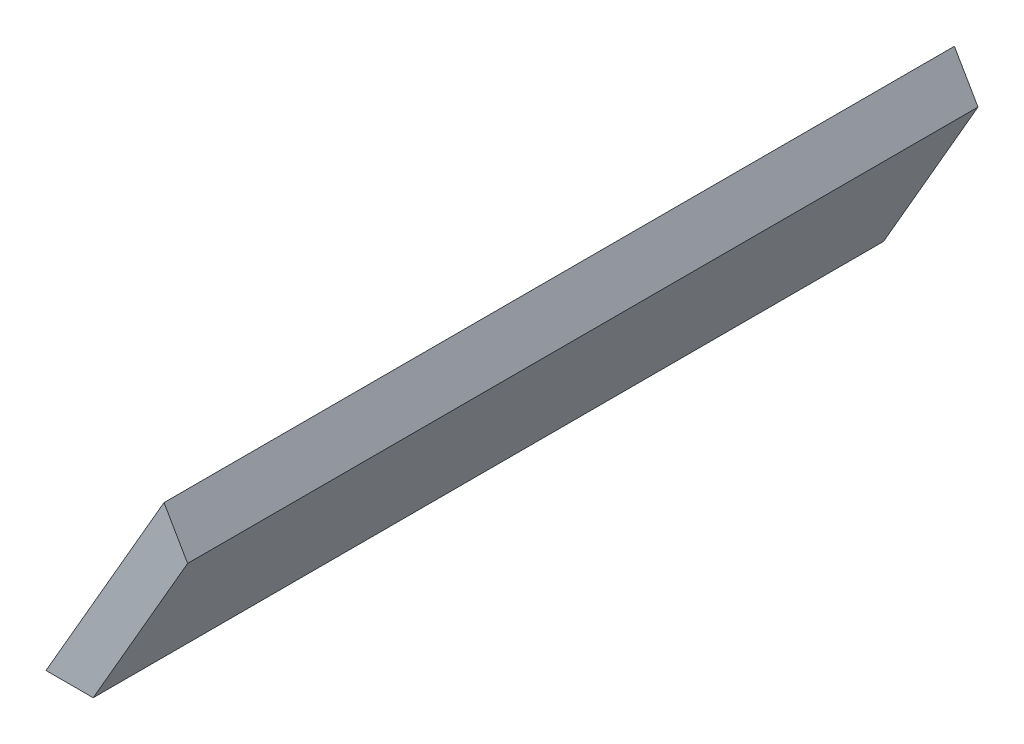
ISO-10303-21;
HEADER;
FILE_DESCRIPTION(('STEP AP214'),'2;1');
FILE_NAME('part.step','',(''),(''),'','','');
FILE_SCHEMA(('AUTOMOTIVE_DESIGN { 1 0 10303 214 1 1 1 1 }'));
ENDSEC;
DATA;
#1=APPLICATION_CONTEXT('core data for automotive mechanical design processes');
#2=APPLICATION_PROTOCOL_DEFINITION('international standard','automotive_design',2000,#1);
#3=PRODUCT_CONTEXT('',#1,'mechanical');
#4=PRODUCT('Part','Part','',(#3));
#5=PRODUCT_RELATED_PRODUCT_CATEGORY('part','',(#4));
#6=PRODUCT_DEFINITION_FORMATION('','',#4);
#7=PRODUCT_DEFINITION_CONTEXT('part definition',#1,'design');
#8=PRODUCT_DEFINITION('design','',#6,#7);
#9=PRODUCT_DEFINITION_SHAPE('','',#8);
#10=(LENGTH_UNIT() NAMED_UNIT(*) SI_UNIT(.MILLI.,.METRE.));
#11=(NAMED_UNIT(*) PLANE_ANGLE_UNIT() SI_UNIT($,.RADIAN.));
#12=(NAMED_UNIT(*) SI_UNIT($,.STERADIAN.) SOLID_ANGLE_UNIT());
#13=UNCERTAINTY_MEASURE_WITH_UNIT(LENGTH_MEASURE(1.E-05),#10,'distance_accuracy_value','');
#14=(GEOMETRIC_REPRESENTATION_CONTEXT(3) GLOBAL_UNCERTAINTY_ASSIGNED_CONTEXT((#13)) GLOBAL_UNIT_ASSIGNED_CONTEXT((#10,
#11,#12)) REPRESENTATION_CONTEXT('',''));
#15=CARTESIAN_POINT('',(0.,0.,0.));
#16=DIRECTION('',(0.,0.,1.));
#17=DIRECTION('',(1.,0.,0.));
#18=AXIS2_PLACEMENT_3D('',#15,#16,#17);
#19=CARTESIAN_POINT('',(-12.9896188202629,7.49867992255546,580.));
#20=DIRECTION('',(0.866050808314088,-0.499955995482118,0.));
#21=DIRECTION('',(0.499955995482118,0.866050808314088,0.));
#22=AXIS2_PLACEMENT_3D('',#19,#20,#21);
#23=PLANE('',#22);
#24=DIRECTION('',(-0.499955995482118,-0.866050808314088,0.));
#25=VECTOR('',#24,1.);
#26=CARTESIAN_POINT('',(-12.9896188202629,7.49867992255546,0.));
#27=LINE('',#26,#25);
#28=CARTESIAN_POINT('',(0.,30.,0.));
#29=VERTEX_POINT('',#28);
#30=CARTESIAN_POINT('',(-86.5923784175028,-120.,0.));
#31=VERTEX_POINT('',#30);
#32=EDGE_CURVE('E98',#29,#31,#27,.T.);
#33=ORIENTED_EDGE('',*,*,#32,.T.);
#34=DIRECTION('',(0.,0.,-1.));
#35=VECTOR('',#34,1.);
#36=CARTESIAN_POINT('',(-86.5923784175028,-120.,580.));
#37=LINE('',#36,#35);
#38=CARTESIAN_POINT('',(-86.5923784175028,-120.,580.));
#39=VERTEX_POINT('',#38);
#40=EDGE_CURVE('E11',#39,#31,#37,.T.);
#41=ORIENTED_EDGE('',*,*,#40,.F.);
#42=DIRECTION('',(-0.499955995482118,-0.866050808314088,0.));
#43=VECTOR('',#42,1.);
#44=CARTESIAN_POINT('',(-12.9896188202629,7.49867992255546,580.));
#45=LINE('',#44,#43);
#46=CARTESIAN_POINT('',(0.,30.,580.));
#47=VERTEX_POINT('',#46);
#48=EDGE_CURVE('E84',#47,#39,#45,.T.);
#49=ORIENTED_EDGE('',*,*,#48,.F.);
#50=DIRECTION('',(0.,0.,-1.));
#51=VECTOR('',#50,1.);
#52=CARTESIAN_POINT('',(0.,30.,580.));
#53=LINE('',#52,#51);
#54=EDGE_CURVE('E51',#47,#29,#53,.T.);
#55=ORIENTED_EDGE('',*,*,#54,.T.);
#56=EDGE_LOOP('',(#33,#41,#49,#55));
#57=FACE_BOUND('',#56,.T.);
#58=ADVANCED_FACE('F35',(#57),#23,.F.);
#59=CARTESIAN_POINT('',(0.,-120.,580.));
#60=DIRECTION('',(0.,1.,0.));
#61=DIRECTION('',(0.,0.,1.));
#62=AXIS2_PLACEMENT_3D('',#59,#60,#61);
#63=PLANE('',#62);
#64=DIRECTION('',(1.,0.,0.));
#65=VECTOR('',#64,1.);
#66=CARTESIAN_POINT('',(0.,-120.,0.));
#67=LINE('',#66,#65);
#68=CARTESIAN_POINT('',(-51.9554270505017,-120.,0.));
#69=VERTEX_POINT('',#68);
#70=EDGE_CURVE('E89',#31,#69,#67,.T.);
#71=ORIENTED_EDGE('',*,*,#70,.T.);
#72=DIRECTION('',(0.,0.,-1.));
#73=VECTOR('',#72,1.);
#74=CARTESIAN_POINT('',(-51.9554270505017,-120.,580.));
#75=LINE('',#74,#73);
#76=CARTESIAN_POINT('',(-51.9554270505017,-120.,580.));
#77=VERTEX_POINT('',#76);
#78=EDGE_CURVE('E43',#77,#69,#75,.T.);
#79=ORIENTED_EDGE('',*,*,#78,.F.);
#80=DIRECTION('',(1.,0.,0.));
#81=VECTOR('',#80,1.);
#82=CARTESIAN_POINT('',(0.,-120.,580.));
#83=LINE('',#82,#81);
#84=EDGE_CURVE('E76',#39,#77,#83,.T.);
#85=ORIENTED_EDGE('',*,*,#84,.F.);
#86=ORIENTED_EDGE('',*,*,#40,.T.);
#87=EDGE_LOOP('',(#71,#79,#85,#86));
#88=FACE_BOUND('',#87,.T.);
#89=ADVANCED_FACE('F88',(#88),#63,.F.);
#90=CARTESIAN_POINT('',(12.9896188202629,-7.49867992255546,580.));
#91=DIRECTION('',(0.866050808314088,-0.499955995482118,0.));
#92=DIRECTION('',(0.499955995482118,0.866050808314088,0.));
#93=AXIS2_PLACEMENT_3D('',#90,#91,#92);
#94=PLANE('',#93);
#95=DIRECTION('',(-0.499955995482118,-0.866050808314088,0.));
#96=VECTOR('',#95,1.);
#97=CARTESIAN_POINT('',(12.9896188202629,-7.49867992255546,0.));
#98=LINE('',#97,#96);
#99=CARTESIAN_POINT('',(17.3184756835006,0.,0.));
#100=VERTEX_POINT('',#99);
#101=EDGE_CURVE('E101',#100,#69,#98,.T.);
#102=ORIENTED_EDGE('',*,*,#101,.F.);
#103=DIRECTION('',(0.,0.,-1.));
#104=VECTOR('',#103,1.);
#105=CARTESIAN_POINT('',(17.3184756835006,0.,580.));
#106=LINE('',#105,#104);
#107=CARTESIAN_POINT('',(17.3184756835006,0.,580.));
#108=VERTEX_POINT('',#107);
#109=EDGE_CURVE('E65',#108,#100,#106,.T.);
#110=ORIENTED_EDGE('',*,*,#109,.F.);
#111=DIRECTION('',(-0.499955995482118,-0.866050808314088,0.));
#112=VECTOR('',#111,1.);
#113=CARTESIAN_POINT('',(12.9896188202629,-7.49867992255546,580.));
#114=LINE('',#113,#112);
#115=EDGE_CURVE('E83',#108,#77,#114,.T.);
#116=ORIENTED_EDGE('',*,*,#115,.T.);
#117=ORIENTED_EDGE('',*,*,#78,.T.);
#118=EDGE_LOOP('',(#102,#110,#116,#117));
#119=FACE_BOUND('',#118,.T.);
#120=ADVANCED_FACE('F92',(#119),#94,.T.);
#121=CARTESIAN_POINT('',(12.9896188202629,7.49867992255546,580.));
#122=DIRECTION('',(0.866050808314088,0.499955995482117,0.));
#123=DIRECTION('',(-0.499955995482117,0.866050808314088,0.));
#124=AXIS2_PLACEMENT_3D('',#121,#122,#123);
#125=PLANE('',#124);
#126=DIRECTION('',(0.499955995482118,-0.866050808314088,0.));
#127=VECTOR('',#126,1.);
#128=CARTESIAN_POINT('',(12.9896188202629,7.49867992255546,0.));
#129=LINE('',#128,#127);
#130=EDGE_CURVE('E103',#29,#100,#129,.T.);
#131=ORIENTED_EDGE('',*,*,#130,.F.);
#132=ORIENTED_EDGE('',*,*,#54,.F.);
#133=DIRECTION('',(0.499955995482118,-0.866050808314088,0.));
#134=VECTOR('',#133,1.);
#135=CARTESIAN_POINT('',(12.9896188202629,7.49867992255546,580.));
#136=LINE('',#135,#134);
#137=EDGE_CURVE('E93',#47,#108,#136,.T.);
#138=ORIENTED_EDGE('',*,*,#137,.T.);
#139=ORIENTED_EDGE('',*,*,#109,.T.);
#140=EDGE_LOOP('',(#131,#132,#138,#139));
#141=FACE_BOUND('',#140,.T.);
#142=ADVANCED_FACE('F109',(#141),#125,.T.);
#143=CARTESIAN_POINT('',(0.,0.,580.));
#144=DIRECTION('',(0.,0.,1.));
#145=DIRECTION('',(1.,0.,0.));
#146=AXIS2_PLACEMENT_3D('',#143,#144,#145);
#147=PLANE('',#146);
#148=ORIENTED_EDGE('',*,*,#48,.T.);
#149=ORIENTED_EDGE('',*,*,#84,.T.);
#150=ORIENTED_EDGE('',*,*,#115,.F.);
#151=ORIENTED_EDGE('',*,*,#137,.F.);
#152=EDGE_LOOP('',(#148,#149,#150,#151));
#153=FACE_BOUND('',#152,.T.);
#154=ADVANCED_FACE('F80',(#153),#147,.T.);
#155=CARTESIAN_POINT('',(0.,0.,0.));
#156=DIRECTION('',(0.,0.,1.));
#157=DIRECTION('',(1.,0.,0.));
#158=AXIS2_PLACEMENT_3D('',#155,#156,#157);
#159=PLANE('',#158);
#160=ORIENTED_EDGE('',*,*,#32,.F.);
#161=ORIENTED_EDGE('',*,*,#130,.T.);
#162=ORIENTED_EDGE('',*,*,#101,.T.);
#163=ORIENTED_EDGE('',*,*,#70,.F.);
#164=EDGE_LOOP('',(#160,#161,#162,#163));
#165=FACE_BOUND('',#164,.T.);
#166=ADVANCED_FACE('F108',(#165),#159,.F.);
#167=CLOSED_SHELL('',(#58,#89,#120,#142,#154,#166));
#168=MANIFOLD_SOLID_BREP('B2',#167);
#169=ADVANCED_BREP_SHAPE_REPRESENTATION('',(#18,#168),#14);
#170=SHAPE_DEFINITION_REPRESENTATION(#9,#169);
ENDSEC;
END-ISO-10303-21;
